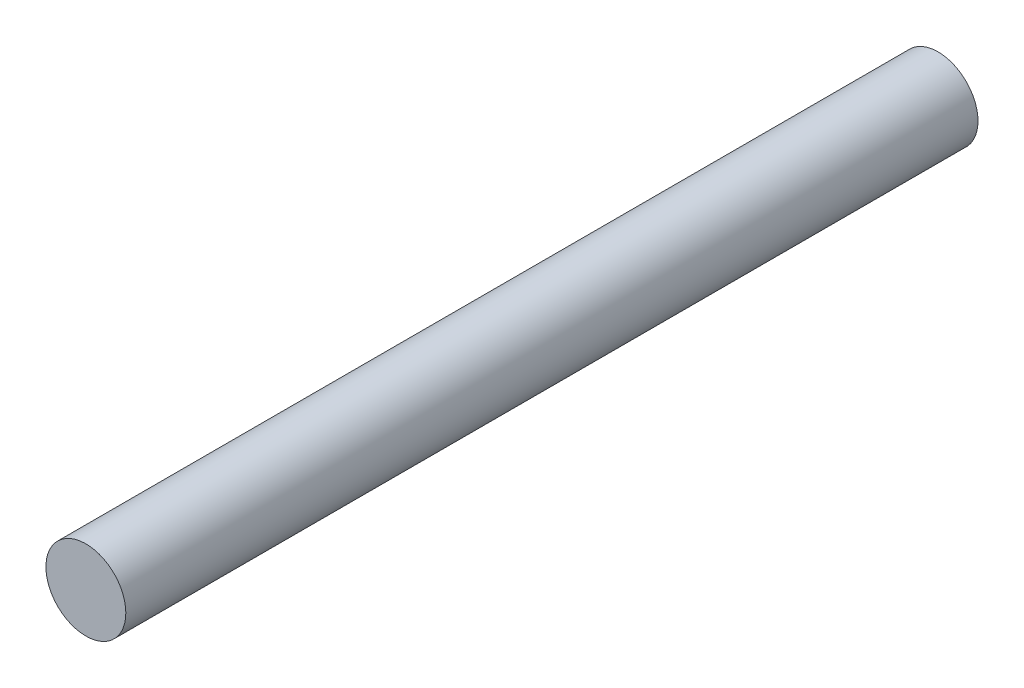
ISO-10303-21;
HEADER;
FILE_DESCRIPTION(('STEP AP214'),'2;1');
FILE_NAME('part.step','',(''),(''),'','','');
FILE_SCHEMA(('AUTOMOTIVE_DESIGN { 1 0 10303 214 1 1 1 1 }'));
ENDSEC;
DATA;
#1=APPLICATION_CONTEXT('core data for automotive mechanical design processes');
#2=APPLICATION_PROTOCOL_DEFINITION('international standard','automotive_design',2000,#1);
#3=PRODUCT_CONTEXT('',#1,'mechanical');
#4=PRODUCT('Part','Part','',(#3));
#5=PRODUCT_RELATED_PRODUCT_CATEGORY('part','',(#4));
#6=PRODUCT_DEFINITION_FORMATION('','',#4);
#7=PRODUCT_DEFINITION_CONTEXT('part definition',#1,'design');
#8=PRODUCT_DEFINITION('design','',#6,#7);
#9=PRODUCT_DEFINITION_SHAPE('','',#8);
#10=(LENGTH_UNIT() NAMED_UNIT(*) SI_UNIT(.MILLI.,.METRE.));
#11=(NAMED_UNIT(*) PLANE_ANGLE_UNIT() SI_UNIT($,.RADIAN.));
#12=(NAMED_UNIT(*) SI_UNIT($,.STERADIAN.) SOLID_ANGLE_UNIT());
#13=UNCERTAINTY_MEASURE_WITH_UNIT(LENGTH_MEASURE(1.E-05),#10,'distance_accuracy_value','');
#14=(GEOMETRIC_REPRESENTATION_CONTEXT(3) GLOBAL_UNCERTAINTY_ASSIGNED_CONTEXT((#13)) GLOBAL_UNIT_ASSIGNED_CONTEXT((#10,
#11,#12)) REPRESENTATION_CONTEXT('',''));
#15=CARTESIAN_POINT('',(0.,0.,0.));
#16=DIRECTION('',(0.,0.,1.));
#17=DIRECTION('',(1.,0.,0.));
#18=AXIS2_PLACEMENT_3D('',#15,#16,#17);
#19=CARTESIAN_POINT('',(0.,0.,16.));
#20=DIRECTION('',(0.,0.,-1.));
#21=DIRECTION('',(-1.,0.,0.));
#22=AXIS2_PLACEMENT_3D('',#19,#20,#21);
#23=CYLINDRICAL_SURFACE('',#22,0.75);
#24=CARTESIAN_POINT('',(0.,0.,16.));
#25=DIRECTION('',(0.,0.,1.));
#26=DIRECTION('',(1.,0.,0.));
#27=AXIS2_PLACEMENT_3D('',#24,#25,#26);
#28=CIRCLE('',#27,0.75);
#29=CARTESIAN_POINT('',(0.75,0.,16.));
#30=VERTEX_POINT('',#29);
#31=EDGE_CURVE('E10',#30,#30,#28,.T.);
#32=ORIENTED_EDGE('',*,*,#31,.F.);
#33=EDGE_LOOP('',(#32));
#34=FACE_BOUND('',#33,.T.);
#35=CARTESIAN_POINT('',(0.,0.,0.));
#36=DIRECTION('',(0.,0.,1.));
#37=DIRECTION('',(1.,0.,0.));
#38=AXIS2_PLACEMENT_3D('',#35,#36,#37);
#39=CIRCLE('',#38,0.75);
#40=CARTESIAN_POINT('',(0.75,0.,0.));
#41=VERTEX_POINT('',#40);
#42=EDGE_CURVE('E37',#41,#41,#39,.T.);
#43=ORIENTED_EDGE('',*,*,#42,.T.);
#44=EDGE_LOOP('',(#43));
#45=FACE_BOUND('',#44,.T.);
#46=ADVANCED_FACE('F34',(#34,#45),#23,.T.);
#47=CARTESIAN_POINT('',(0.,0.,16.));
#48=DIRECTION('',(0.,0.,1.));
#49=DIRECTION('',(1.,0.,0.));
#50=AXIS2_PLACEMENT_3D('',#47,#48,#49);
#51=PLANE('',#50);
#52=ORIENTED_EDGE('',*,*,#31,.T.);
#53=EDGE_LOOP('',(#52));
#54=FACE_BOUND('',#53,.T.);
#55=ADVANCED_FACE('F49',(#54),#51,.T.);
#56=CARTESIAN_POINT('',(0.,0.,0.));
#57=DIRECTION('',(0.,0.,1.));
#58=DIRECTION('',(1.,0.,0.));
#59=AXIS2_PLACEMENT_3D('',#56,#57,#58);
#60=PLANE('',#59);
#61=ORIENTED_EDGE('',*,*,#42,.F.);
#62=EDGE_LOOP('',(#61));
#63=FACE_BOUND('',#62,.T.);
#64=ADVANCED_FACE('F47',(#63),#60,.F.);
#65=CLOSED_SHELL('',(#46,#55,#64));
#66=MANIFOLD_SOLID_BREP('B2',#65);
#67=ADVANCED_BREP_SHAPE_REPRESENTATION('',(#18,#66),#14);
#68=SHAPE_DEFINITION_REPRESENTATION(#9,#67);
ENDSEC;
END-ISO-10303-21;
